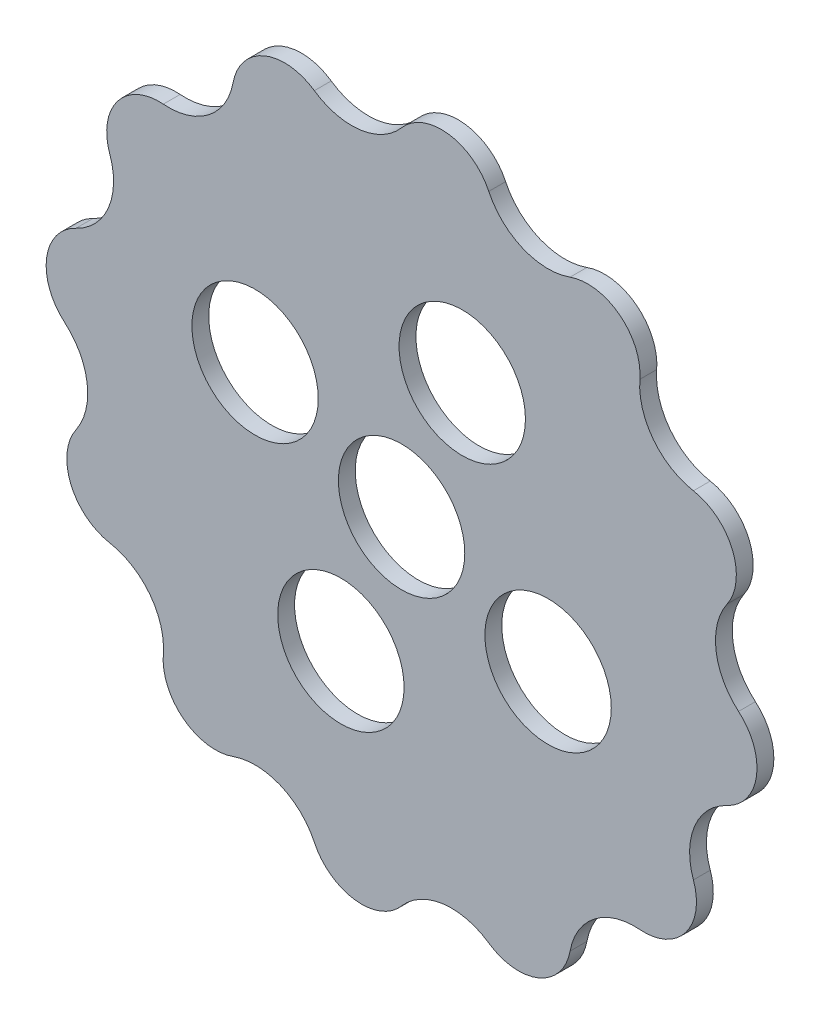
ISO-10303-21;
HEADER;
FILE_DESCRIPTION(('STEP AP214'),'2;1');
FILE_NAME('part.step','',(''),(''),'','','');
FILE_SCHEMA(('AUTOMOTIVE_DESIGN { 1 0 10303 214 1 1 1 1 }'));
ENDSEC;
DATA;
#1=APPLICATION_CONTEXT('core data for automotive mechanical design processes');
#2=APPLICATION_PROTOCOL_DEFINITION('international standard','automotive_design',2000,#1);
#3=PRODUCT_CONTEXT('',#1,'mechanical');
#4=PRODUCT('Part','Part','',(#3));
#5=PRODUCT_RELATED_PRODUCT_CATEGORY('part','',(#4));
#6=PRODUCT_DEFINITION_FORMATION('','',#4);
#7=PRODUCT_DEFINITION_CONTEXT('part definition',#1,'design');
#8=PRODUCT_DEFINITION('design','',#6,#7);
#9=PRODUCT_DEFINITION_SHAPE('','',#8);
#10=(LENGTH_UNIT() NAMED_UNIT(*) SI_UNIT(.MILLI.,.METRE.));
#11=(NAMED_UNIT(*) PLANE_ANGLE_UNIT() SI_UNIT($,.RADIAN.));
#12=(NAMED_UNIT(*) SI_UNIT($,.STERADIAN.) SOLID_ANGLE_UNIT());
#13=UNCERTAINTY_MEASURE_WITH_UNIT(LENGTH_MEASURE(1.E-05),#10,'distance_accuracy_value','');
#14=(GEOMETRIC_REPRESENTATION_CONTEXT(3) GLOBAL_UNCERTAINTY_ASSIGNED_CONTEXT((#13)) GLOBAL_UNIT_ASSIGNED_CONTEXT((#10,
#11,#12)) REPRESENTATION_CONTEXT('',''));
#15=CARTESIAN_POINT('',(0.,0.,0.));
#16=DIRECTION('',(0.,0.,1.));
#17=DIRECTION('',(1.,0.,0.));
#18=AXIS2_PLACEMENT_3D('',#15,#16,#17);
#19=CARTESIAN_POINT('',(0.,0.,4.));
#20=DIRECTION('',(0.,0.,1.));
#21=DIRECTION('',(1.,0.,0.));
#22=AXIS2_PLACEMENT_3D('',#19,#20,#21);
#23=PLANE('',#22);
#24=CARTESIAN_POINT('',(34.7813471063072,-14.4069056890388,4.));
#25=DIRECTION('',(0.,0.,1.));
#26=DIRECTION('',(1.,0.,0.));
#27=AXIS2_PLACEMENT_3D('',#24,#25,#26);
#28=CIRCLE('',#27,15.);
#29=CARTESIAN_POINT('',(49.7813471063072,-14.4069056890388,4.));
#30=VERTEX_POINT('',#29);
#31=EDGE_CURVE('E964',#30,#30,#28,.T.);
#32=ORIENTED_EDGE('',*,*,#31,.F.);
#33=EDGE_LOOP('',(#32));
#34=FACE_BOUND('',#33,.T.);
#35=CARTESIAN_POINT('',(-14.4069056890367,-34.7813471063081,4.));
#36=DIRECTION('',(0.,0.,1.));
#37=DIRECTION('',(1.,0.,0.));
#38=AXIS2_PLACEMENT_3D('',#35,#36,#37);
#39=CIRCLE('',#38,15.0000000000018);
#40=CARTESIAN_POINT('',(0.59309431096511,-34.7813471063081,4.));
#41=VERTEX_POINT('',#40);
#42=EDGE_CURVE('E970',#41,#41,#39,.T.);
#43=ORIENTED_EDGE('',*,*,#42,.F.);
#44=EDGE_LOOP('',(#43));
#45=FACE_BOUND('',#44,.T.);
#46=CARTESIAN_POINT('',(-34.7813471063067,14.4069056890373,4.));
#47=DIRECTION('',(0.,0.,1.));
#48=DIRECTION('',(1.,0.,0.));
#49=AXIS2_PLACEMENT_3D('',#46,#47,#48);
#50=CIRCLE('',#49,15.0000000000018);
#51=CARTESIAN_POINT('',(-19.7813471063049,14.4069056890373,4.));
#52=VERTEX_POINT('',#51);
#53=EDGE_CURVE('E981',#52,#52,#50,.T.);
#54=ORIENTED_EDGE('',*,*,#53,.F.);
#55=EDGE_LOOP('',(#54));
#56=FACE_BOUND('',#55,.T.);
#57=CARTESIAN_POINT('',(14.4069056890387,34.7813471063073,4.));
#58=DIRECTION('',(0.,0.,1.));
#59=DIRECTION('',(1.,0.,0.));
#60=AXIS2_PLACEMENT_3D('',#57,#58,#59);
#61=CIRCLE('',#60,15.);
#62=CARTESIAN_POINT('',(29.4069056890387,34.7813471063073,4.));
#63=VERTEX_POINT('',#62);
#64=EDGE_CURVE('E965',#63,#63,#61,.T.);
#65=ORIENTED_EDGE('',*,*,#64,.F.);
#66=EDGE_LOOP('',(#65));
#67=FACE_BOUND('',#66,.T.);
#68=CARTESIAN_POINT('',(0.,0.,4.));
#69=DIRECTION('',(0.,0.,1.));
#70=DIRECTION('',(1.,0.,0.));
#71=AXIS2_PLACEMENT_3D('',#68,#69,#70);
#72=CIRCLE('',#71,15.);
#73=CARTESIAN_POINT('',(15.,0.,4.));
#74=VERTEX_POINT('',#73);
#75=EDGE_CURVE('E354',#74,#74,#72,.T.);
#76=ORIENTED_EDGE('',*,*,#75,.F.);
#77=EDGE_LOOP('',(#76));
#78=FACE_BOUND('',#77,.T.);
#79=CARTESIAN_POINT('',(72.0854743188944,55.3131298861517,4.));
#80=DIRECTION('',(0.,0.,1.));
#81=DIRECTION('',(1.,0.,0.));
#82=AXIS2_PLACEMENT_3D('',#79,#80,#81);
#83=CIRCLE('',#82,15.5676341827527);
#84=CARTESIAN_POINT('',(56.5685424949239,56.5685424949237,4.));
#85=VERTEX_POINT('',#84);
#86=CARTESIAN_POINT('',(69.2820323027552,39.9999999999999,4.));
#87=VERTEX_POINT('',#86);
#88=EDGE_CURVE('E349',#85,#87,#83,.T.);
#89=ORIENTED_EDGE('',*,*,#88,.F.);
#90=CARTESIAN_POINT('',(44.1759199829254,57.5711797903511,4.));
#91=DIRECTION('',(0.,0.,1.));
#92=DIRECTION('',(1.,0.,0.));
#93=AXIS2_PLACEMENT_3D('',#90,#91,#92);
#94=CIRCLE('',#93,12.4331160322372);
#95=CARTESIAN_POINT('',(40.0000000000001,69.282032302755,4.));
#96=VERTEX_POINT('',#95);
#97=EDGE_CURVE('E340',#96,#85,#94,.F.);
#98=ORIENTED_EDGE('',*,*,#97,.F.);
#99=CARTESIAN_POINT('',(34.7712870609374,83.9453128036828,4.));
#100=DIRECTION('',(0.,0.,1.));
#101=DIRECTION('',(1.,0.,0.));
#102=AXIS2_PLACEMENT_3D('',#99,#100,#101);
#103=CIRCLE('',#102,15.5676341827527);
#104=CARTESIAN_POINT('',(20.7055236082017,77.2740661031254,4.));
#105=VERTEX_POINT('',#104);
#106=EDGE_CURVE('E444',#105,#96,#103,.T.);
#107=ORIENTED_EDGE('',*,*,#106,.F.);
#108=CARTESIAN_POINT('',(9.47187904558642,71.9460642157481,4.));
#109=DIRECTION('',(0.,0.,1.));
#110=DIRECTION('',(1.,0.,0.));
#111=AXIS2_PLACEMENT_3D('',#108,#109,#110);
#112=CIRCLE('',#111,12.4331160322372);
#113=CARTESIAN_POINT('',(0.,80.,4.));
#114=VERTEX_POINT('',#113);
#115=EDGE_CURVE('E441',#114,#105,#112,.F.);
#116=ORIENTED_EDGE('',*,*,#115,.F.);
#117=CARTESIAN_POINT('',(-11.8598384847883,90.084416947087,4.));
#118=DIRECTION('',(0.,0.,1.));
#119=DIRECTION('',(1.,0.,0.));
#120=AXIS2_PLACEMENT_3D('',#117,#118,#119);
#121=CIRCLE('',#120,15.5676341827524);
#122=CARTESIAN_POINT('',(-20.7055236082037,77.2740661031249,4.));
#123=VERTEX_POINT('',#122);
#124=EDGE_CURVE('E404',#123,#114,#121,.T.);
#125=ORIENTED_EDGE('',*,*,#124,.F.);
#126=CARTESIAN_POINT('',(-27.7701442328225,67.0430588359355,4.));
#127=DIRECTION('',(0.,0.,1.));
#128=DIRECTION('',(1.,0.,0.));
#129=AXIS2_PLACEMENT_3D('',#126,#127,#128);
#130=CIRCLE('',#129,12.4331160322372);
#131=CARTESIAN_POINT('',(-40.0000000000001,69.2820323027551,4.));
#132=VERTEX_POINT('',#131);
#133=EDGE_CURVE('E456',#132,#123,#130,.F.);
#134=ORIENTED_EDGE('',*,*,#133,.F.);
#135=CARTESIAN_POINT('',(-55.3131298861518,72.0854743188941,4.));
#136=DIRECTION('',(0.,0.,1.));
#137=DIRECTION('',(1.,0.,0.));
#138=AXIS2_PLACEMENT_3D('',#135,#136,#137);
#139=CIRCLE('',#138,15.5676341827526);
#140=CARTESIAN_POINT('',(-56.5685424949238,56.5685424949238,4.));
#141=VERTEX_POINT('',#140);
#142=EDGE_CURVE('E465',#141,#132,#139,.T.);
#143=ORIENTED_EDGE('',*,*,#142,.F.);
#144=CARTESIAN_POINT('',(-57.5711797903512,44.1759199829252,4.));
#145=DIRECTION('',(0.,0.,1.));
#146=DIRECTION('',(1.,0.,0.));
#147=AXIS2_PLACEMENT_3D('',#144,#145,#146);
#148=CIRCLE('',#147,12.4331160322372);
#149=CARTESIAN_POINT('',(-69.2820323027551,39.9999999999999,4.));
#150=VERTEX_POINT('',#149);
#151=EDGE_CURVE('E462',#150,#141,#148,.F.);
#152=ORIENTED_EDGE('',*,*,#151,.F.);
#153=CARTESIAN_POINT('',(-83.9453128036828,34.7712870609372,4.));
#154=DIRECTION('',(0.,0.,1.));
#155=DIRECTION('',(1.,0.,0.));
#156=AXIS2_PLACEMENT_3D('',#153,#154,#155);
#157=CIRCLE('',#156,15.5676341827526);
#158=CARTESIAN_POINT('',(-77.2740661031254,20.7055236082017,4.));
#159=VERTEX_POINT('',#158);
#160=EDGE_CURVE('E392',#159,#150,#157,.T.);
#161=ORIENTED_EDGE('',*,*,#160,.F.);
#162=CARTESIAN_POINT('',(-71.9460642157481,9.47187904558632,4.));
#163=DIRECTION('',(0.,0.,1.));
#164=DIRECTION('',(1.,0.,0.));
#165=AXIS2_PLACEMENT_3D('',#162,#163,#164);
#166=CIRCLE('',#165,12.4331160322372);
#167=CARTESIAN_POINT('',(-80.,0.,4.));
#168=VERTEX_POINT('',#167);
#169=EDGE_CURVE('E476',#168,#159,#166,.F.);
#170=ORIENTED_EDGE('',*,*,#169,.F.);
#171=CARTESIAN_POINT('',(-90.0844169470891,-11.8598384847887,4.));
#172=DIRECTION('',(0.,0.,1.));
#173=DIRECTION('',(1.,0.,0.));
#174=AXIS2_PLACEMENT_3D('',#171,#172,#173);
#175=CIRCLE('',#174,15.5676341827527);
#176=CARTESIAN_POINT('',(-77.2740661031254,-20.7055236082017,4.));
#177=VERTEX_POINT('',#176);
#178=EDGE_CURVE('E484',#177,#168,#175,.T.);
#179=ORIENTED_EDGE('',*,*,#178,.F.);
#180=CARTESIAN_POINT('',(-67.0430588359376,-27.7701442328228,4.));
#181=DIRECTION('',(0.,0.,1.));
#182=DIRECTION('',(1.,0.,0.));
#183=AXIS2_PLACEMENT_3D('',#180,#181,#182);
#184=CIRCLE('',#183,12.4331160322372);
#185=CARTESIAN_POINT('',(-69.282032302755,-40.0000000000001,4.));
#186=VERTEX_POINT('',#185);
#187=EDGE_CURVE('E481',#186,#177,#184,.F.);
#188=ORIENTED_EDGE('',*,*,#187,.F.);
#189=CARTESIAN_POINT('',(-72.0854743188943,-55.3131298861519,4.));
#190=DIRECTION('',(0.,0.,1.));
#191=DIRECTION('',(1.,0.,0.));
#192=AXIS2_PLACEMENT_3D('',#189,#190,#191);
#193=CIRCLE('',#192,15.5676341827526);
#194=CARTESIAN_POINT('',(-56.5685424949239,-56.5685424949237,4.));
#195=VERTEX_POINT('',#194);
#196=EDGE_CURVE('E380',#195,#186,#193,.T.);
#197=ORIENTED_EDGE('',*,*,#196,.F.);
#198=CARTESIAN_POINT('',(-44.1759199829254,-57.5711797903513,4.));
#199=DIRECTION('',(0.,0.,1.));
#200=DIRECTION('',(1.,0.,0.));
#201=AXIS2_PLACEMENT_3D('',#198,#199,#200);
#202=CIRCLE('',#201,12.4331160322372);
#203=CARTESIAN_POINT('',(-40.,-69.2820323027551,4.));
#204=VERTEX_POINT('',#203);
#205=EDGE_CURVE('E495',#204,#195,#202,.F.);
#206=ORIENTED_EDGE('',*,*,#205,.F.);
#207=CARTESIAN_POINT('',(-34.7712870609373,-83.9453128036829,4.));
#208=DIRECTION('',(0.,0.,1.));
#209=DIRECTION('',(1.,0.,0.));
#210=AXIS2_PLACEMENT_3D('',#207,#208,#209);
#211=CIRCLE('',#210,15.5676341827527);
#212=CARTESIAN_POINT('',(-20.7055236082018,-77.2740661031254,4.));
#213=VERTEX_POINT('',#212);
#214=EDGE_CURVE('E502',#213,#204,#211,.T.);
#215=ORIENTED_EDGE('',*,*,#214,.F.);
#216=CARTESIAN_POINT('',(-9.47187904558641,-71.9460642157482,4.));
#217=DIRECTION('',(0.,0.,1.));
#218=DIRECTION('',(1.,0.,0.));
#219=AXIS2_PLACEMENT_3D('',#216,#217,#218);
#220=CIRCLE('',#219,12.4331160322372);
#221=CARTESIAN_POINT('',(0.,-80.,4.));
#222=VERTEX_POINT('',#221);
#223=EDGE_CURVE('E439',#222,#213,#220,.F.);
#224=ORIENTED_EDGE('',*,*,#223,.F.);
#225=CARTESIAN_POINT('',(11.8598384847886,-90.0844169470892,4.));
#226=DIRECTION('',(0.,0.,1.));
#227=DIRECTION('',(1.,0.,0.));
#228=AXIS2_PLACEMENT_3D('',#225,#226,#227);
#229=CIRCLE('',#228,15.5676341827527);
#230=CARTESIAN_POINT('',(20.7055236082015,-77.2740661031255,4.));
#231=VERTEX_POINT('',#230);
#232=EDGE_CURVE('E368',#231,#222,#229,.T.);
#233=ORIENTED_EDGE('',*,*,#232,.F.);
#234=CARTESIAN_POINT('',(27.7701442328227,-67.0430588359377,4.));
#235=DIRECTION('',(0.,0.,1.));
#236=DIRECTION('',(1.,0.,0.));
#237=AXIS2_PLACEMENT_3D('',#234,#235,#236);
#238=CIRCLE('',#237,12.4331160322372);
#239=CARTESIAN_POINT('',(40.,-69.2820323027551,4.));
#240=VERTEX_POINT('',#239);
#241=EDGE_CURVE('E432',#240,#231,#238,.F.);
#242=ORIENTED_EDGE('',*,*,#241,.F.);
#243=CARTESIAN_POINT('',(55.3131298861518,-72.0854743188943,4.));
#244=DIRECTION('',(0.,0.,1.));
#245=DIRECTION('',(1.,0.,0.));
#246=AXIS2_PLACEMENT_3D('',#243,#244,#245);
#247=CIRCLE('',#246,15.5676341827526);
#248=CARTESIAN_POINT('',(56.5685424949236,-56.568542494924,4.));
#249=VERTEX_POINT('',#248);
#250=EDGE_CURVE('E429',#249,#240,#247,.T.);
#251=ORIENTED_EDGE('',*,*,#250,.F.);
#252=CARTESIAN_POINT('',(57.5711797903512,-44.1759199829254,4.));
#253=DIRECTION('',(0.,0.,1.));
#254=DIRECTION('',(1.,0.,0.));
#255=AXIS2_PLACEMENT_3D('',#252,#253,#254);
#256=CIRCLE('',#255,12.4331160322372);
#257=CARTESIAN_POINT('',(69.2820323027551,-40.0000000000001,4.));
#258=VERTEX_POINT('',#257);
#259=EDGE_CURVE('E423',#258,#249,#256,.F.);
#260=ORIENTED_EDGE('',*,*,#259,.F.);
#261=CARTESIAN_POINT('',(83.9453128036828,-34.7712870609374,4.));
#262=DIRECTION('',(0.,0.,1.));
#263=DIRECTION('',(1.,0.,0.));
#264=AXIS2_PLACEMENT_3D('',#261,#262,#263);
#265=CIRCLE('',#264,15.5676341827526);
#266=CARTESIAN_POINT('',(77.2740661031254,-20.7055236082019,4.));
#267=VERTEX_POINT('',#266);
#268=EDGE_CURVE('E357',#267,#258,#265,.T.);
#269=ORIENTED_EDGE('',*,*,#268,.F.);
#270=CARTESIAN_POINT('',(71.9460642157481,-9.4718790455865,4.));
#271=DIRECTION('',(0.,0.,1.));
#272=DIRECTION('',(1.,0.,0.));
#273=AXIS2_PLACEMENT_3D('',#270,#271,#272);
#274=CIRCLE('',#273,12.4331160322372);
#275=CARTESIAN_POINT('',(80.,0.,4.));
#276=VERTEX_POINT('',#275);
#277=EDGE_CURVE('E511',#276,#267,#274,.F.);
#278=ORIENTED_EDGE('',*,*,#277,.F.);
#279=CARTESIAN_POINT('',(90.0844169470891,11.8598384847885,4.));
#280=DIRECTION('',(0.,0.,1.));
#281=DIRECTION('',(1.,0.,0.));
#282=AXIS2_PLACEMENT_3D('',#279,#280,#281);
#283=CIRCLE('',#282,15.5676341827526);
#284=CARTESIAN_POINT('',(77.2740661031255,20.7055236082015,4.));
#285=VERTEX_POINT('',#284);
#286=EDGE_CURVE('E518',#285,#276,#283,.T.);
#287=ORIENTED_EDGE('',*,*,#286,.F.);
#288=CARTESIAN_POINT('',(67.0430588359376,27.7701442328226,4.));
#289=DIRECTION('',(0.,0.,1.));
#290=DIRECTION('',(1.,0.,0.));
#291=AXIS2_PLACEMENT_3D('',#288,#289,#290);
#292=CIRCLE('',#291,12.4331160322372);
#293=EDGE_CURVE('E416',#87,#285,#292,.F.);
#294=ORIENTED_EDGE('',*,*,#293,.F.);
#295=EDGE_LOOP('',(#89,#98,#107,#116,#125,#134,#143,#152,#161,#170,#179,#188,#197,#206,#215,
#224,#233,#242,#251,#260,#269,#278,#287,#294));
#296=FACE_BOUND('',#295,.T.);
#297=ADVANCED_FACE('F162',(#34,#45,#56,#67,#78,#296),#23,.T.);
#298=CARTESIAN_POINT('',(0.,0.,0.));
#299=DIRECTION('',(0.,0.,1.));
#300=DIRECTION('',(1.,0.,0.));
#301=AXIS2_PLACEMENT_3D('',#298,#299,#300);
#302=PLANE('',#301);
#303=CARTESIAN_POINT('',(34.7813471063072,-14.4069056890388,0.));
#304=DIRECTION('',(0.,0.,1.));
#305=DIRECTION('',(1.,0.,0.));
#306=AXIS2_PLACEMENT_3D('',#303,#304,#305);
#307=CIRCLE('',#306,15.);
#308=CARTESIAN_POINT('',(49.7813471063072,-14.4069056890388,0.));
#309=VERTEX_POINT('',#308);
#310=EDGE_CURVE('E962',#309,#309,#307,.T.);
#311=ORIENTED_EDGE('',*,*,#310,.T.);
#312=EDGE_LOOP('',(#311));
#313=FACE_BOUND('',#312,.T.);
#314=CARTESIAN_POINT('',(-14.4069056890367,-34.7813471063081,0.));
#315=DIRECTION('',(0.,0.,1.));
#316=DIRECTION('',(1.,0.,0.));
#317=AXIS2_PLACEMENT_3D('',#314,#315,#316);
#318=CIRCLE('',#317,15.0000000000018);
#319=CARTESIAN_POINT('',(0.59309431096511,-34.7813471063081,0.));
#320=VERTEX_POINT('',#319);
#321=EDGE_CURVE('E978',#320,#320,#318,.T.);
#322=ORIENTED_EDGE('',*,*,#321,.T.);
#323=EDGE_LOOP('',(#322));
#324=FACE_BOUND('',#323,.T.);
#325=CARTESIAN_POINT('',(-34.7813471063067,14.4069056890373,0.));
#326=DIRECTION('',(0.,0.,1.));
#327=DIRECTION('',(1.,0.,0.));
#328=AXIS2_PLACEMENT_3D('',#325,#326,#327);
#329=CIRCLE('',#328,15.0000000000018);
#330=CARTESIAN_POINT('',(-19.7813471063049,14.4069056890373,0.));
#331=VERTEX_POINT('',#330);
#332=EDGE_CURVE('E973',#331,#331,#329,.T.);
#333=ORIENTED_EDGE('',*,*,#332,.T.);
#334=EDGE_LOOP('',(#333));
#335=FACE_BOUND('',#334,.T.);
#336=CARTESIAN_POINT('',(14.4069056890387,34.7813471063073,0.));
#337=DIRECTION('',(0.,0.,1.));
#338=DIRECTION('',(1.,0.,0.));
#339=AXIS2_PLACEMENT_3D('',#336,#337,#338);
#340=CIRCLE('',#339,15.);
#341=CARTESIAN_POINT('',(29.4069056890387,34.7813471063073,0.));
#342=VERTEX_POINT('',#341);
#343=EDGE_CURVE('E968',#342,#342,#340,.T.);
#344=ORIENTED_EDGE('',*,*,#343,.T.);
#345=EDGE_LOOP('',(#344));
#346=FACE_BOUND('',#345,.T.);
#347=CARTESIAN_POINT('',(0.,0.,0.));
#348=DIRECTION('',(0.,0.,1.));
#349=DIRECTION('',(1.,0.,0.));
#350=AXIS2_PLACEMENT_3D('',#347,#348,#349);
#351=CIRCLE('',#350,15.);
#352=CARTESIAN_POINT('',(15.,0.,0.));
#353=VERTEX_POINT('',#352);
#354=EDGE_CURVE('E351',#353,#353,#351,.T.);
#355=ORIENTED_EDGE('',*,*,#354,.T.);
#356=EDGE_LOOP('',(#355));
#357=FACE_BOUND('',#356,.T.);
#358=CARTESIAN_POINT('',(44.1759199829254,57.5711797903511,0.));
#359=DIRECTION('',(0.,0.,1.));
#360=DIRECTION('',(1.,0.,0.));
#361=AXIS2_PLACEMENT_3D('',#358,#359,#360);
#362=CIRCLE('',#361,12.4331160322372);
#363=CARTESIAN_POINT('',(40.0000000000001,69.282032302755,0.));
#364=VERTEX_POINT('',#363);
#365=CARTESIAN_POINT('',(56.5685424949239,56.5685424949237,0.));
#366=VERTEX_POINT('',#365);
#367=EDGE_CURVE('E325',#364,#366,#362,.F.);
#368=ORIENTED_EDGE('',*,*,#367,.T.);
#369=CARTESIAN_POINT('',(72.0854743188944,55.3131298861517,0.));
#370=DIRECTION('',(0.,0.,1.));
#371=DIRECTION('',(1.,0.,0.));
#372=AXIS2_PLACEMENT_3D('',#369,#370,#371);
#373=CIRCLE('',#372,15.5676341827527);
#374=CARTESIAN_POINT('',(69.2820323027552,39.9999999999999,0.));
#375=VERTEX_POINT('',#374);
#376=EDGE_CURVE('E329',#366,#375,#373,.T.);
#377=ORIENTED_EDGE('',*,*,#376,.T.);
#378=CARTESIAN_POINT('',(67.0430588359376,27.7701442328226,0.));
#379=DIRECTION('',(0.,0.,1.));
#380=DIRECTION('',(1.,0.,0.));
#381=AXIS2_PLACEMENT_3D('',#378,#379,#380);
#382=CIRCLE('',#381,12.4331160322372);
#383=CARTESIAN_POINT('',(77.2740661031255,20.7055236082015,0.));
#384=VERTEX_POINT('',#383);
#385=EDGE_CURVE('E508',#375,#384,#382,.F.);
#386=ORIENTED_EDGE('',*,*,#385,.T.);
#387=CARTESIAN_POINT('',(90.0844169470891,11.8598384847885,0.));
#388=DIRECTION('',(0.,0.,1.));
#389=DIRECTION('',(1.,0.,0.));
#390=AXIS2_PLACEMENT_3D('',#387,#388,#389);
#391=CIRCLE('',#390,15.5676341827526);
#392=CARTESIAN_POINT('',(80.,0.,0.));
#393=VERTEX_POINT('',#392);
#394=EDGE_CURVE('E510',#384,#393,#391,.T.);
#395=ORIENTED_EDGE('',*,*,#394,.T.);
#396=CARTESIAN_POINT('',(71.9460642157481,-9.4718790455865,0.));
#397=DIRECTION('',(0.,0.,1.));
#398=DIRECTION('',(1.,0.,0.));
#399=AXIS2_PLACEMENT_3D('',#396,#397,#398);
#400=CIRCLE('',#399,12.4331160322372);
#401=CARTESIAN_POINT('',(77.2740661031254,-20.7055236082019,0.));
#402=VERTEX_POINT('',#401);
#403=EDGE_CURVE('E514',#393,#402,#400,.F.);
#404=ORIENTED_EDGE('',*,*,#403,.T.);
#405=CARTESIAN_POINT('',(83.9453128036828,-34.7712870609374,0.));
#406=DIRECTION('',(0.,0.,1.));
#407=DIRECTION('',(1.,0.,0.));
#408=AXIS2_PLACEMENT_3D('',#405,#406,#407);
#409=CIRCLE('',#408,15.5676341827526);
#410=CARTESIAN_POINT('',(69.2820323027551,-40.0000000000001,0.));
#411=VERTEX_POINT('',#410);
#412=EDGE_CURVE('E359',#402,#411,#409,.T.);
#413=ORIENTED_EDGE('',*,*,#412,.T.);
#414=CARTESIAN_POINT('',(57.5711797903512,-44.1759199829254,0.));
#415=DIRECTION('',(0.,0.,1.));
#416=DIRECTION('',(1.,0.,0.));
#417=AXIS2_PLACEMENT_3D('',#414,#415,#416);
#418=CIRCLE('',#417,12.4331160322372);
#419=CARTESIAN_POINT('',(56.5685424949236,-56.568542494924,0.));
#420=VERTEX_POINT('',#419);
#421=EDGE_CURVE('E425',#411,#420,#418,.F.);
#422=ORIENTED_EDGE('',*,*,#421,.T.);
#423=CARTESIAN_POINT('',(55.3131298861518,-72.0854743188943,0.));
#424=DIRECTION('',(0.,0.,1.));
#425=DIRECTION('',(1.,0.,0.));
#426=AXIS2_PLACEMENT_3D('',#423,#424,#425);
#427=CIRCLE('',#426,15.5676341827526);
#428=CARTESIAN_POINT('',(40.,-69.2820323027551,0.));
#429=VERTEX_POINT('',#428);
#430=EDGE_CURVE('E419',#420,#429,#427,.T.);
#431=ORIENTED_EDGE('',*,*,#430,.T.);
#432=CARTESIAN_POINT('',(27.7701442328227,-67.0430588359377,0.));
#433=DIRECTION('',(0.,0.,1.));
#434=DIRECTION('',(1.,0.,0.));
#435=AXIS2_PLACEMENT_3D('',#432,#433,#434);
#436=CIRCLE('',#435,12.4331160322372);
#437=CARTESIAN_POINT('',(20.7055236082015,-77.2740661031255,0.));
#438=VERTEX_POINT('',#437);
#439=EDGE_CURVE('E422',#429,#438,#436,.F.);
#440=ORIENTED_EDGE('',*,*,#439,.T.);
#441=CARTESIAN_POINT('',(11.8598384847886,-90.0844169470892,0.));
#442=DIRECTION('',(0.,0.,1.));
#443=DIRECTION('',(1.,0.,0.));
#444=AXIS2_PLACEMENT_3D('',#441,#442,#443);
#445=CIRCLE('',#444,15.5676341827527);
#446=CARTESIAN_POINT('',(0.,-80.,0.));
#447=VERTEX_POINT('',#446);
#448=EDGE_CURVE('E371',#438,#447,#445,.T.);
#449=ORIENTED_EDGE('',*,*,#448,.T.);
#450=CARTESIAN_POINT('',(-9.47187904558641,-71.9460642157482,0.));
#451=DIRECTION('',(0.,0.,1.));
#452=DIRECTION('',(1.,0.,0.));
#453=AXIS2_PLACEMENT_3D('',#450,#451,#452);
#454=CIRCLE('',#453,12.4331160322372);
#455=CARTESIAN_POINT('',(-20.7055236082018,-77.2740661031254,0.));
#456=VERTEX_POINT('',#455);
#457=EDGE_CURVE('E491',#447,#456,#454,.F.);
#458=ORIENTED_EDGE('',*,*,#457,.T.);
#459=CARTESIAN_POINT('',(-34.7712870609373,-83.9453128036829,0.));
#460=DIRECTION('',(0.,0.,1.));
#461=DIRECTION('',(1.,0.,0.));
#462=AXIS2_PLACEMENT_3D('',#459,#460,#461);
#463=CIRCLE('',#462,15.5676341827527);
#464=CARTESIAN_POINT('',(-40.,-69.2820323027552,0.));
#465=VERTEX_POINT('',#464);
#466=EDGE_CURVE('E494',#456,#465,#463,.T.);
#467=ORIENTED_EDGE('',*,*,#466,.T.);
#468=CARTESIAN_POINT('',(-44.1759199829254,-57.5711797903513,0.));
#469=DIRECTION('',(0.,0.,1.));
#470=DIRECTION('',(1.,0.,0.));
#471=AXIS2_PLACEMENT_3D('',#468,#469,#470);
#472=CIRCLE('',#471,12.4331160322372);
#473=CARTESIAN_POINT('',(-56.5685424949239,-56.5685424949237,0.));
#474=VERTEX_POINT('',#473);
#475=EDGE_CURVE('E179',#465,#474,#472,.F.);
#476=ORIENTED_EDGE('',*,*,#475,.T.);
#477=CARTESIAN_POINT('',(-72.0854743188943,-55.3131298861519,0.));
#478=DIRECTION('',(0.,0.,1.));
#479=DIRECTION('',(1.,0.,0.));
#480=AXIS2_PLACEMENT_3D('',#477,#478,#479);
#481=CIRCLE('',#480,15.5676341827526);
#482=CARTESIAN_POINT('',(-69.282032302755,-40.0000000000001,0.));
#483=VERTEX_POINT('',#482);
#484=EDGE_CURVE('E383',#474,#483,#481,.T.);
#485=ORIENTED_EDGE('',*,*,#484,.T.);
#486=CARTESIAN_POINT('',(-67.0430588359376,-27.7701442328228,0.));
#487=DIRECTION('',(0.,0.,1.));
#488=DIRECTION('',(1.,0.,0.));
#489=AXIS2_PLACEMENT_3D('',#486,#487,#488);
#490=CIRCLE('',#489,12.4331160322372);
#491=CARTESIAN_POINT('',(-77.2740661031254,-20.7055236082017,0.));
#492=VERTEX_POINT('',#491);
#493=EDGE_CURVE('E472',#483,#492,#490,.F.);
#494=ORIENTED_EDGE('',*,*,#493,.T.);
#495=CARTESIAN_POINT('',(-90.0844169470891,-11.8598384847887,0.));
#496=DIRECTION('',(0.,0.,1.));
#497=DIRECTION('',(1.,0.,0.));
#498=AXIS2_PLACEMENT_3D('',#495,#496,#497);
#499=CIRCLE('',#498,15.5676341827527);
#500=CARTESIAN_POINT('',(-80.,-1.16226472890446E-13,0.));
#501=VERTEX_POINT('',#500);
#502=EDGE_CURVE('E475',#492,#501,#499,.T.);
#503=ORIENTED_EDGE('',*,*,#502,.T.);
#504=CARTESIAN_POINT('',(-71.9460642157481,9.47187904558632,0.));
#505=DIRECTION('',(0.,0.,1.));
#506=DIRECTION('',(1.,0.,0.));
#507=AXIS2_PLACEMENT_3D('',#504,#505,#506);
#508=CIRCLE('',#507,12.4331160322372);
#509=CARTESIAN_POINT('',(-77.2740661031254,20.7055236082017,0.));
#510=VERTEX_POINT('',#509);
#511=EDGE_CURVE('E187',#501,#510,#508,.F.);
#512=ORIENTED_EDGE('',*,*,#511,.T.);
#513=CARTESIAN_POINT('',(-83.9453128036828,34.7712870609372,0.));
#514=DIRECTION('',(0.,0.,1.));
#515=DIRECTION('',(1.,0.,0.));
#516=AXIS2_PLACEMENT_3D('',#513,#514,#515);
#517=CIRCLE('',#516,15.5676341827526);
#518=CARTESIAN_POINT('',(-69.2820323027551,39.9999999999999,0.));
#519=VERTEX_POINT('',#518);
#520=EDGE_CURVE('E395',#510,#519,#517,.T.);
#521=ORIENTED_EDGE('',*,*,#520,.T.);
#522=CARTESIAN_POINT('',(-57.5711797903512,44.1759199829252,0.));
#523=DIRECTION('',(0.,0.,1.));
#524=DIRECTION('',(1.,0.,0.));
#525=AXIS2_PLACEMENT_3D('',#522,#523,#524);
#526=CIRCLE('',#525,12.4331160322372);
#527=CARTESIAN_POINT('',(-56.5685424949238,56.5685424949238,0.));
#528=VERTEX_POINT('',#527);
#529=EDGE_CURVE('E452',#519,#528,#526,.F.);
#530=ORIENTED_EDGE('',*,*,#529,.T.);
#531=CARTESIAN_POINT('',(-55.3131298861518,72.0854743188941,0.));
#532=DIRECTION('',(0.,0.,1.));
#533=DIRECTION('',(1.,0.,0.));
#534=AXIS2_PLACEMENT_3D('',#531,#532,#533);
#535=CIRCLE('',#534,15.5676341827526);
#536=CARTESIAN_POINT('',(-40.,69.282032302755,0.));
#537=VERTEX_POINT('',#536);
#538=EDGE_CURVE('E455',#528,#537,#535,.T.);
#539=ORIENTED_EDGE('',*,*,#538,.T.);
#540=CARTESIAN_POINT('',(-27.7701442328225,67.0430588359355,0.));
#541=DIRECTION('',(0.,0.,1.));
#542=DIRECTION('',(1.,0.,0.));
#543=AXIS2_PLACEMENT_3D('',#540,#541,#542);
#544=CIRCLE('',#543,12.4331160322372);
#545=CARTESIAN_POINT('',(-20.7055236082037,77.2740661031249,0.));
#546=VERTEX_POINT('',#545);
#547=EDGE_CURVE('E459',#537,#546,#544,.F.);
#548=ORIENTED_EDGE('',*,*,#547,.T.);
#549=CARTESIAN_POINT('',(-11.8598384847883,90.084416947087,0.));
#550=DIRECTION('',(0.,0.,1.));
#551=DIRECTION('',(1.,0.,0.));
#552=AXIS2_PLACEMENT_3D('',#549,#550,#551);
#553=CIRCLE('',#552,15.5676341827524);
#554=CARTESIAN_POINT('',(0.,80.,0.));
#555=VERTEX_POINT('',#554);
#556=EDGE_CURVE('E407',#546,#555,#553,.T.);
#557=ORIENTED_EDGE('',*,*,#556,.T.);
#558=CARTESIAN_POINT('',(9.47187904558642,71.9460642157481,0.));
#559=DIRECTION('',(0.,0.,1.));
#560=DIRECTION('',(1.,0.,0.));
#561=AXIS2_PLACEMENT_3D('',#558,#559,#560);
#562=CIRCLE('',#561,12.4331160322372);
#563=CARTESIAN_POINT('',(20.7055236082017,77.2740661031254,0.));
#564=VERTEX_POINT('',#563);
#565=EDGE_CURVE('E334',#555,#564,#562,.F.);
#566=ORIENTED_EDGE('',*,*,#565,.T.);
#567=CARTESIAN_POINT('',(34.7712870609374,83.9453128036828,0.));
#568=DIRECTION('',(0.,0.,1.));
#569=DIRECTION('',(1.,0.,0.));
#570=AXIS2_PLACEMENT_3D('',#567,#568,#569);
#571=CIRCLE('',#570,15.5676341827527);
#572=EDGE_CURVE('E332',#564,#364,#571,.T.);
#573=ORIENTED_EDGE('',*,*,#572,.T.);
#574=EDGE_LOOP('',(#368,#377,#386,#395,#404,#413,#422,#431,#440,#449,#458,#467,#476,#485,#494,
#503,#512,#521,#530,#539,#548,#557,#566,#573));
#575=FACE_BOUND('',#574,.T.);
#576=ADVANCED_FACE('F164',(#313,#324,#335,#346,#357,#575),#302,.F.);
#577=CARTESIAN_POINT('',(67.0430588359376,27.7701442328226,0.));
#578=DIRECTION('',(0.,0.,1.));
#579=DIRECTION('',(1.,0.,0.));
#580=AXIS2_PLACEMENT_3D('',#577,#578,#579);
#581=CYLINDRICAL_SURFACE('',#580,12.4331160322372);
#582=ORIENTED_EDGE('',*,*,#293,.T.);
#583=DIRECTION('',(0.,0.,1.));
#584=VECTOR('',#583,1.);
#585=CARTESIAN_POINT('',(77.2740661031255,20.7055236082015,0.));
#586=LINE('',#585,#584);
#587=EDGE_CURVE('E166',#384,#285,#586,.T.);
#588=ORIENTED_EDGE('',*,*,#587,.F.);
#589=ORIENTED_EDGE('',*,*,#385,.F.);
#590=DIRECTION('',(0.,0.,1.));
#591=VECTOR('',#590,1.);
#592=CARTESIAN_POINT('',(69.2820323027552,39.9999999999999,0.));
#593=LINE('',#592,#591);
#594=EDGE_CURVE('E344',#375,#87,#593,.T.);
#595=ORIENTED_EDGE('',*,*,#594,.T.);
#596=EDGE_LOOP('',(#582,#588,#589,#595));
#597=FACE_BOUND('',#596,.T.);
#598=ADVANCED_FACE('F529',(#597),#581,.T.);
#599=CARTESIAN_POINT('',(71.9460642157481,-9.4718790455865,0.));
#600=DIRECTION('',(0.,0.,1.));
#601=DIRECTION('',(1.,0.,0.));
#602=AXIS2_PLACEMENT_3D('',#599,#600,#601);
#603=CYLINDRICAL_SURFACE('',#602,12.4331160322372);
#604=ORIENTED_EDGE('',*,*,#277,.T.);
#605=DIRECTION('',(0.,0.,1.));
#606=VECTOR('',#605,1.);
#607=CARTESIAN_POINT('',(77.2740661031254,-20.7055236082019,0.));
#608=LINE('',#607,#606);
#609=EDGE_CURVE('E362',#402,#267,#608,.T.);
#610=ORIENTED_EDGE('',*,*,#609,.F.);
#611=ORIENTED_EDGE('',*,*,#403,.F.);
#612=DIRECTION('',(0.,0.,1.));
#613=VECTOR('',#612,1.);
#614=CARTESIAN_POINT('',(80.,0.,0.));
#615=LINE('',#614,#613);
#616=EDGE_CURVE('E433',#393,#276,#615,.T.);
#617=ORIENTED_EDGE('',*,*,#616,.T.);
#618=EDGE_LOOP('',(#604,#610,#611,#617));
#619=FACE_BOUND('',#618,.T.);
#620=ADVANCED_FACE('F533',(#619),#603,.T.);
#621=CARTESIAN_POINT('',(90.0844169470891,11.8598384847885,0.));
#622=DIRECTION('',(0.,0.,1.));
#623=DIRECTION('',(1.,0.,0.));
#624=AXIS2_PLACEMENT_3D('',#621,#622,#623);
#625=CYLINDRICAL_SURFACE('',#624,15.5676341827526);
#626=ORIENTED_EDGE('',*,*,#286,.T.);
#627=ORIENTED_EDGE('',*,*,#616,.F.);
#628=ORIENTED_EDGE('',*,*,#394,.F.);
#629=ORIENTED_EDGE('',*,*,#587,.T.);
#630=EDGE_LOOP('',(#626,#627,#628,#629));
#631=FACE_BOUND('',#630,.T.);
#632=ADVANCED_FACE('F525',(#631),#625,.F.);
#633=CARTESIAN_POINT('',(34.7712870609374,83.9453128036828,0.));
#634=DIRECTION('',(0.,0.,1.));
#635=DIRECTION('',(1.,0.,0.));
#636=AXIS2_PLACEMENT_3D('',#633,#634,#635);
#637=CYLINDRICAL_SURFACE('',#636,15.5676341827527);
#638=ORIENTED_EDGE('',*,*,#106,.T.);
#639=DIRECTION('',(0.,0.,1.));
#640=VECTOR('',#639,1.);
#641=CARTESIAN_POINT('',(40.0000000000001,69.282032302755,0.));
#642=LINE('',#641,#640);
#643=EDGE_CURVE('E171',#364,#96,#642,.T.);
#644=ORIENTED_EDGE('',*,*,#643,.F.);
#645=ORIENTED_EDGE('',*,*,#572,.F.);
#646=DIRECTION('',(0.,0.,1.));
#647=VECTOR('',#646,1.);
#648=CARTESIAN_POINT('',(20.7055236082017,77.2740661031254,0.));
#649=LINE('',#648,#647);
#650=EDGE_CURVE('E12',#564,#105,#649,.T.);
#651=ORIENTED_EDGE('',*,*,#650,.T.);
#652=EDGE_LOOP('',(#638,#644,#645,#651));
#653=FACE_BOUND('',#652,.T.);
#654=ADVANCED_FACE('F600',(#653),#637,.F.);
#655=CARTESIAN_POINT('',(9.47187904558642,71.9460642157481,0.));
#656=DIRECTION('',(0.,0.,1.));
#657=DIRECTION('',(1.,0.,0.));
#658=AXIS2_PLACEMENT_3D('',#655,#656,#657);
#659=CYLINDRICAL_SURFACE('',#658,12.4331160322372);
#660=ORIENTED_EDGE('',*,*,#115,.T.);
#661=ORIENTED_EDGE('',*,*,#650,.F.);
#662=ORIENTED_EDGE('',*,*,#565,.F.);
#663=DIRECTION('',(0.,0.,1.));
#664=VECTOR('',#663,1.);
#665=CARTESIAN_POINT('',(0.,80.,0.));
#666=LINE('',#665,#664);
#667=EDGE_CURVE('E413',#555,#114,#666,.T.);
#668=ORIENTED_EDGE('',*,*,#667,.T.);
#669=EDGE_LOOP('',(#660,#661,#662,#668));
#670=FACE_BOUND('',#669,.T.);
#671=ADVANCED_FACE('F597',(#670),#659,.T.);
#672=CARTESIAN_POINT('',(44.1759199829254,57.5711797903511,0.));
#673=DIRECTION('',(0.,0.,1.));
#674=DIRECTION('',(1.,0.,0.));
#675=AXIS2_PLACEMENT_3D('',#672,#673,#674);
#676=CYLINDRICAL_SURFACE('',#675,12.4331160322372);
#677=ORIENTED_EDGE('',*,*,#97,.T.);
#678=DIRECTION('',(0.,0.,1.));
#679=VECTOR('',#678,1.);
#680=CARTESIAN_POINT('',(56.5685424949239,56.5685424949237,0.));
#681=LINE('',#680,#679);
#682=EDGE_CURVE('E337',#366,#85,#681,.T.);
#683=ORIENTED_EDGE('',*,*,#682,.F.);
#684=ORIENTED_EDGE('',*,*,#367,.F.);
#685=ORIENTED_EDGE('',*,*,#643,.T.);
#686=EDGE_LOOP('',(#677,#683,#684,#685));
#687=FACE_BOUND('',#686,.T.);
#688=ADVANCED_FACE('F338',(#687),#676,.T.);
#689=CARTESIAN_POINT('',(-57.5711797903512,44.1759199829252,0.));
#690=DIRECTION('',(0.,0.,1.));
#691=DIRECTION('',(1.,0.,0.));
#692=AXIS2_PLACEMENT_3D('',#689,#690,#691);
#693=CYLINDRICAL_SURFACE('',#692,12.4331160322372);
#694=ORIENTED_EDGE('',*,*,#151,.T.);
#695=DIRECTION('',(0.,0.,1.));
#696=VECTOR('',#695,1.);
#697=CARTESIAN_POINT('',(-56.5685424949238,56.5685424949238,0.));
#698=LINE('',#697,#696);
#699=EDGE_CURVE('E461',#528,#141,#698,.T.);
#700=ORIENTED_EDGE('',*,*,#699,.F.);
#701=ORIENTED_EDGE('',*,*,#529,.F.);
#702=DIRECTION('',(0.,0.,1.));
#703=VECTOR('',#702,1.);
#704=CARTESIAN_POINT('',(-69.2820323027551,39.9999999999999,0.));
#705=LINE('',#704,#703);
#706=EDGE_CURVE('E401',#519,#150,#705,.T.);
#707=ORIENTED_EDGE('',*,*,#706,.T.);
#708=EDGE_LOOP('',(#694,#700,#701,#707));
#709=FACE_BOUND('',#708,.T.);
#710=ADVANCED_FACE('F583',(#709),#693,.T.);
#711=CARTESIAN_POINT('',(-27.7701442328225,67.0430588359355,0.));
#712=DIRECTION('',(0.,0.,1.));
#713=DIRECTION('',(1.,0.,0.));
#714=AXIS2_PLACEMENT_3D('',#711,#712,#713);
#715=CYLINDRICAL_SURFACE('',#714,12.4331160322372);
#716=ORIENTED_EDGE('',*,*,#133,.T.);
#717=DIRECTION('',(0.,0.,1.));
#718=VECTOR('',#717,1.);
#719=CARTESIAN_POINT('',(-20.7055236082037,77.2740661031249,0.));
#720=LINE('',#719,#718);
#721=EDGE_CURVE('E410',#546,#123,#720,.T.);
#722=ORIENTED_EDGE('',*,*,#721,.F.);
#723=ORIENTED_EDGE('',*,*,#547,.F.);
#724=DIRECTION('',(0.,0.,1.));
#725=VECTOR('',#724,1.);
#726=CARTESIAN_POINT('',(-40.0000000000001,69.2820323027551,0.));
#727=LINE('',#726,#725);
#728=EDGE_CURVE('E447',#537,#132,#727,.T.);
#729=ORIENTED_EDGE('',*,*,#728,.T.);
#730=EDGE_LOOP('',(#716,#722,#723,#729));
#731=FACE_BOUND('',#730,.T.);
#732=ADVANCED_FACE('F590',(#731),#715,.T.);
#733=CARTESIAN_POINT('',(-55.3131298861518,72.0854743188941,0.));
#734=DIRECTION('',(0.,0.,1.));
#735=DIRECTION('',(1.,0.,0.));
#736=AXIS2_PLACEMENT_3D('',#733,#734,#735);
#737=CYLINDRICAL_SURFACE('',#736,15.5676341827526);
#738=ORIENTED_EDGE('',*,*,#142,.T.);
#739=ORIENTED_EDGE('',*,*,#728,.F.);
#740=ORIENTED_EDGE('',*,*,#538,.F.);
#741=ORIENTED_EDGE('',*,*,#699,.T.);
#742=EDGE_LOOP('',(#738,#739,#740,#741));
#743=FACE_BOUND('',#742,.T.);
#744=ADVANCED_FACE('F588',(#743),#737,.F.);
#745=CARTESIAN_POINT('',(-67.0430588359376,-27.7701442328228,0.));
#746=DIRECTION('',(0.,0.,1.));
#747=DIRECTION('',(1.,0.,0.));
#748=AXIS2_PLACEMENT_3D('',#745,#746,#747);
#749=CYLINDRICAL_SURFACE('',#748,12.4331160322372);
#750=ORIENTED_EDGE('',*,*,#187,.T.);
#751=DIRECTION('',(0.,0.,1.));
#752=VECTOR('',#751,1.);
#753=CARTESIAN_POINT('',(-77.2740661031254,-20.7055236082017,0.));
#754=LINE('',#753,#752);
#755=EDGE_CURVE('E480',#492,#177,#754,.T.);
#756=ORIENTED_EDGE('',*,*,#755,.F.);
#757=ORIENTED_EDGE('',*,*,#493,.F.);
#758=DIRECTION('',(0.,0.,1.));
#759=VECTOR('',#758,1.);
#760=CARTESIAN_POINT('',(-69.282032302755,-40.0000000000001,0.));
#761=LINE('',#760,#759);
#762=EDGE_CURVE('E389',#483,#186,#761,.T.);
#763=ORIENTED_EDGE('',*,*,#762,.T.);
#764=EDGE_LOOP('',(#750,#756,#757,#763));
#765=FACE_BOUND('',#764,.T.);
#766=ADVANCED_FACE('F568',(#765),#749,.T.);
#767=CARTESIAN_POINT('',(-71.9460642157481,9.47187904558632,0.));
#768=DIRECTION('',(0.,0.,1.));
#769=DIRECTION('',(1.,0.,0.));
#770=AXIS2_PLACEMENT_3D('',#767,#768,#769);
#771=CYLINDRICAL_SURFACE('',#770,12.4331160322372);
#772=ORIENTED_EDGE('',*,*,#169,.T.);
#773=DIRECTION('',(0.,0.,1.));
#774=VECTOR('',#773,1.);
#775=CARTESIAN_POINT('',(-77.2740661031254,20.7055236082017,0.));
#776=LINE('',#775,#774);
#777=EDGE_CURVE('E398',#510,#159,#776,.T.);
#778=ORIENTED_EDGE('',*,*,#777,.F.);
#779=ORIENTED_EDGE('',*,*,#511,.F.);
#780=DIRECTION('',(0.,0.,1.));
#781=VECTOR('',#780,1.);
#782=CARTESIAN_POINT('',(-80.,0.,0.));
#783=LINE('',#782,#781);
#784=EDGE_CURVE('E466',#501,#168,#783,.T.);
#785=ORIENTED_EDGE('',*,*,#784,.T.);
#786=EDGE_LOOP('',(#772,#778,#779,#785));
#787=FACE_BOUND('',#786,.T.);
#788=ADVANCED_FACE('F574',(#787),#771,.T.);
#789=CARTESIAN_POINT('',(-90.0844169470891,-11.8598384847887,0.));
#790=DIRECTION('',(0.,0.,1.));
#791=DIRECTION('',(1.,0.,0.));
#792=AXIS2_PLACEMENT_3D('',#789,#790,#791);
#793=CYLINDRICAL_SURFACE('',#792,15.5676341827527);
#794=ORIENTED_EDGE('',*,*,#178,.T.);
#795=ORIENTED_EDGE('',*,*,#784,.F.);
#796=ORIENTED_EDGE('',*,*,#502,.F.);
#797=ORIENTED_EDGE('',*,*,#755,.T.);
#798=EDGE_LOOP('',(#794,#795,#796,#797));
#799=FACE_BOUND('',#798,.T.);
#800=ADVANCED_FACE('F572',(#799),#793,.F.);
#801=CARTESIAN_POINT('',(-9.47187904558641,-71.9460642157482,0.));
#802=DIRECTION('',(0.,0.,1.));
#803=DIRECTION('',(1.,0.,0.));
#804=AXIS2_PLACEMENT_3D('',#801,#802,#803);
#805=CYLINDRICAL_SURFACE('',#804,12.4331160322372);
#806=ORIENTED_EDGE('',*,*,#223,.T.);
#807=DIRECTION('',(0.,0.,1.));
#808=VECTOR('',#807,1.);
#809=CARTESIAN_POINT('',(-20.7055236082018,-77.2740661031254,0.));
#810=LINE('',#809,#808);
#811=EDGE_CURVE('E499',#456,#213,#810,.T.);
#812=ORIENTED_EDGE('',*,*,#811,.F.);
#813=ORIENTED_EDGE('',*,*,#457,.F.);
#814=DIRECTION('',(0.,0.,1.));
#815=VECTOR('',#814,1.);
#816=CARTESIAN_POINT('',(0.,-80.,0.));
#817=LINE('',#816,#815);
#818=EDGE_CURVE('E377',#447,#222,#817,.T.);
#819=ORIENTED_EDGE('',*,*,#818,.T.);
#820=EDGE_LOOP('',(#806,#812,#813,#819));
#821=FACE_BOUND('',#820,.T.);
#822=ADVANCED_FACE('F555',(#821),#805,.T.);
#823=CARTESIAN_POINT('',(-44.1759199829254,-57.5711797903513,0.));
#824=DIRECTION('',(0.,0.,1.));
#825=DIRECTION('',(1.,0.,0.));
#826=AXIS2_PLACEMENT_3D('',#823,#824,#825);
#827=CYLINDRICAL_SURFACE('',#826,12.4331160322372);
#828=ORIENTED_EDGE('',*,*,#205,.T.);
#829=DIRECTION('',(0.,0.,1.));
#830=VECTOR('',#829,1.);
#831=CARTESIAN_POINT('',(-56.5685424949239,-56.5685424949237,0.));
#832=LINE('',#831,#830);
#833=EDGE_CURVE('E386',#474,#195,#832,.T.);
#834=ORIENTED_EDGE('',*,*,#833,.F.);
#835=ORIENTED_EDGE('',*,*,#475,.F.);
#836=DIRECTION('',(0.,0.,1.));
#837=VECTOR('',#836,1.);
#838=CARTESIAN_POINT('',(-40.,-69.2820323027551,0.));
#839=LINE('',#838,#837);
#840=EDGE_CURVE('E485',#465,#204,#839,.T.);
#841=ORIENTED_EDGE('',*,*,#840,.T.);
#842=EDGE_LOOP('',(#828,#834,#835,#841));
#843=FACE_BOUND('',#842,.T.);
#844=ADVANCED_FACE('F561',(#843),#827,.T.);
#845=CARTESIAN_POINT('',(-34.7712870609373,-83.9453128036829,0.));
#846=DIRECTION('',(0.,0.,1.));
#847=DIRECTION('',(1.,0.,0.));
#848=AXIS2_PLACEMENT_3D('',#845,#846,#847);
#849=CYLINDRICAL_SURFACE('',#848,15.5676341827527);
#850=ORIENTED_EDGE('',*,*,#214,.T.);
#851=ORIENTED_EDGE('',*,*,#840,.F.);
#852=ORIENTED_EDGE('',*,*,#466,.F.);
#853=ORIENTED_EDGE('',*,*,#811,.T.);
#854=EDGE_LOOP('',(#850,#851,#852,#853));
#855=FACE_BOUND('',#854,.T.);
#856=ADVANCED_FACE('F559',(#855),#849,.F.);
#857=CARTESIAN_POINT('',(55.3131298861518,-72.0854743188943,0.));
#858=DIRECTION('',(0.,0.,1.));
#859=DIRECTION('',(1.,0.,0.));
#860=AXIS2_PLACEMENT_3D('',#857,#858,#859);
#861=CYLINDRICAL_SURFACE('',#860,15.5676341827526);
#862=ORIENTED_EDGE('',*,*,#250,.T.);
#863=DIRECTION('',(0.,0.,1.));
#864=VECTOR('',#863,1.);
#865=CARTESIAN_POINT('',(40.,-69.2820323027551,0.));
#866=LINE('',#865,#864);
#867=EDGE_CURVE('E428',#429,#240,#866,.T.);
#868=ORIENTED_EDGE('',*,*,#867,.F.);
#869=ORIENTED_EDGE('',*,*,#430,.F.);
#870=DIRECTION('',(0.,0.,1.));
#871=VECTOR('',#870,1.);
#872=CARTESIAN_POINT('',(56.5685424949236,-56.568542494924,0.));
#873=LINE('',#872,#871);
#874=EDGE_CURVE('E437',#420,#249,#873,.T.);
#875=ORIENTED_EDGE('',*,*,#874,.T.);
#876=EDGE_LOOP('',(#862,#868,#869,#875));
#877=FACE_BOUND('',#876,.T.);
#878=ADVANCED_FACE('F543',(#877),#861,.F.);
#879=CARTESIAN_POINT('',(57.5711797903512,-44.1759199829254,0.));
#880=DIRECTION('',(0.,0.,1.));
#881=DIRECTION('',(1.,0.,0.));
#882=AXIS2_PLACEMENT_3D('',#879,#880,#881);
#883=CYLINDRICAL_SURFACE('',#882,12.4331160322372);
#884=ORIENTED_EDGE('',*,*,#259,.T.);
#885=ORIENTED_EDGE('',*,*,#874,.F.);
#886=ORIENTED_EDGE('',*,*,#421,.F.);
#887=DIRECTION('',(0.,0.,1.));
#888=VECTOR('',#887,1.);
#889=CARTESIAN_POINT('',(69.2820323027551,-40.0000000000001,0.));
#890=LINE('',#889,#888);
#891=EDGE_CURVE('E365',#411,#258,#890,.T.);
#892=ORIENTED_EDGE('',*,*,#891,.T.);
#893=EDGE_LOOP('',(#884,#885,#886,#892));
#894=FACE_BOUND('',#893,.T.);
#895=ADVANCED_FACE('F540',(#894),#883,.T.);
#896=CARTESIAN_POINT('',(27.7701442328227,-67.0430588359377,0.));
#897=DIRECTION('',(0.,0.,1.));
#898=DIRECTION('',(1.,0.,0.));
#899=AXIS2_PLACEMENT_3D('',#896,#897,#898);
#900=CYLINDRICAL_SURFACE('',#899,12.4331160322372);
#901=ORIENTED_EDGE('',*,*,#241,.T.);
#902=DIRECTION('',(0.,0.,1.));
#903=VECTOR('',#902,1.);
#904=CARTESIAN_POINT('',(20.7055236082015,-77.2740661031255,0.));
#905=LINE('',#904,#903);
#906=EDGE_CURVE('E374',#438,#231,#905,.T.);
#907=ORIENTED_EDGE('',*,*,#906,.F.);
#908=ORIENTED_EDGE('',*,*,#439,.F.);
#909=ORIENTED_EDGE('',*,*,#867,.T.);
#910=EDGE_LOOP('',(#901,#907,#908,#909));
#911=FACE_BOUND('',#910,.T.);
#912=ADVANCED_FACE('F548',(#911),#900,.T.);
#913=CARTESIAN_POINT('',(-11.8598384847883,90.084416947087,0.));
#914=DIRECTION('',(0.,0.,1.));
#915=DIRECTION('',(1.,0.,0.));
#916=AXIS2_PLACEMENT_3D('',#913,#914,#915);
#917=CYLINDRICAL_SURFACE('',#916,15.5676341827524);
#918=ORIENTED_EDGE('',*,*,#124,.T.);
#919=ORIENTED_EDGE('',*,*,#667,.F.);
#920=ORIENTED_EDGE('',*,*,#556,.F.);
#921=ORIENTED_EDGE('',*,*,#721,.T.);
#922=EDGE_LOOP('',(#918,#919,#920,#921));
#923=FACE_BOUND('',#922,.T.);
#924=ADVANCED_FACE('F595',(#923),#917,.F.);
#925=CARTESIAN_POINT('',(-83.9453128036828,34.7712870609372,0.));
#926=DIRECTION('',(0.,0.,1.));
#927=DIRECTION('',(1.,0.,0.));
#928=AXIS2_PLACEMENT_3D('',#925,#926,#927);
#929=CYLINDRICAL_SURFACE('',#928,15.5676341827526);
#930=ORIENTED_EDGE('',*,*,#160,.T.);
#931=ORIENTED_EDGE('',*,*,#706,.F.);
#932=ORIENTED_EDGE('',*,*,#520,.F.);
#933=ORIENTED_EDGE('',*,*,#777,.T.);
#934=EDGE_LOOP('',(#930,#931,#932,#933));
#935=FACE_BOUND('',#934,.T.);
#936=ADVANCED_FACE('F578',(#935),#929,.F.);
#937=CARTESIAN_POINT('',(-72.0854743188943,-55.3131298861519,0.));
#938=DIRECTION('',(0.,0.,1.));
#939=DIRECTION('',(1.,0.,0.));
#940=AXIS2_PLACEMENT_3D('',#937,#938,#939);
#941=CYLINDRICAL_SURFACE('',#940,15.5676341827526);
#942=ORIENTED_EDGE('',*,*,#196,.T.);
#943=ORIENTED_EDGE('',*,*,#762,.F.);
#944=ORIENTED_EDGE('',*,*,#484,.F.);
#945=ORIENTED_EDGE('',*,*,#833,.T.);
#946=EDGE_LOOP('',(#942,#943,#944,#945));
#947=FACE_BOUND('',#946,.T.);
#948=ADVANCED_FACE('F566',(#947),#941,.F.);
#949=CARTESIAN_POINT('',(11.8598384847886,-90.0844169470892,0.));
#950=DIRECTION('',(0.,0.,1.));
#951=DIRECTION('',(1.,0.,0.));
#952=AXIS2_PLACEMENT_3D('',#949,#950,#951);
#953=CYLINDRICAL_SURFACE('',#952,15.5676341827527);
#954=ORIENTED_EDGE('',*,*,#232,.T.);
#955=ORIENTED_EDGE('',*,*,#818,.F.);
#956=ORIENTED_EDGE('',*,*,#448,.F.);
#957=ORIENTED_EDGE('',*,*,#906,.T.);
#958=EDGE_LOOP('',(#954,#955,#956,#957));
#959=FACE_BOUND('',#958,.T.);
#960=ADVANCED_FACE('F552',(#959),#953,.F.);
#961=CARTESIAN_POINT('',(83.9453128036828,-34.7712870609374,0.));
#962=DIRECTION('',(0.,0.,1.));
#963=DIRECTION('',(1.,0.,0.));
#964=AXIS2_PLACEMENT_3D('',#961,#962,#963);
#965=CYLINDRICAL_SURFACE('',#964,15.5676341827526);
#966=ORIENTED_EDGE('',*,*,#268,.T.);
#967=ORIENTED_EDGE('',*,*,#891,.F.);
#968=ORIENTED_EDGE('',*,*,#412,.F.);
#969=ORIENTED_EDGE('',*,*,#609,.T.);
#970=EDGE_LOOP('',(#966,#967,#968,#969));
#971=FACE_BOUND('',#970,.T.);
#972=ADVANCED_FACE('F536',(#971),#965,.F.);
#973=CARTESIAN_POINT('',(72.0854743188944,55.3131298861517,0.));
#974=DIRECTION('',(0.,0.,1.));
#975=DIRECTION('',(1.,0.,0.));
#976=AXIS2_PLACEMENT_3D('',#973,#974,#975);
#977=CYLINDRICAL_SURFACE('',#976,15.5676341827527);
#978=ORIENTED_EDGE('',*,*,#88,.T.);
#979=ORIENTED_EDGE('',*,*,#594,.F.);
#980=ORIENTED_EDGE('',*,*,#376,.F.);
#981=ORIENTED_EDGE('',*,*,#682,.T.);
#982=EDGE_LOOP('',(#978,#979,#980,#981));
#983=FACE_BOUND('',#982,.T.);
#984=ADVANCED_FACE('F347',(#983),#977,.F.);
#985=CARTESIAN_POINT('',(0.,0.,0.));
#986=DIRECTION('',(0.,0.,1.));
#987=DIRECTION('',(1.,0.,0.));
#988=AXIS2_PLACEMENT_3D('',#985,#986,#987);
#989=CYLINDRICAL_SURFACE('',#988,15.);
#990=ORIENTED_EDGE('',*,*,#354,.F.);
#991=EDGE_LOOP('',(#990));
#992=FACE_BOUND('',#991,.T.);
#993=ORIENTED_EDGE('',*,*,#75,.T.);
#994=EDGE_LOOP('',(#993));
#995=FACE_BOUND('',#994,.T.);
#996=ADVANCED_FACE('F727',(#992,#995),#989,.F.);
#997=CARTESIAN_POINT('',(14.4069056890387,34.7813471063073,0.));
#998=DIRECTION('',(0.,0.,1.));
#999=DIRECTION('',(1.,0.,0.));
#1000=AXIS2_PLACEMENT_3D('',#997,#998,#999);
#1001=CYLINDRICAL_SURFACE('',#1000,15.);
#1002=ORIENTED_EDGE('',*,*,#343,.F.);
#1003=EDGE_LOOP('',(#1002));
#1004=FACE_BOUND('',#1003,.T.);
#1005=ORIENTED_EDGE('',*,*,#64,.T.);
#1006=EDGE_LOOP('',(#1005));
#1007=FACE_BOUND('',#1006,.T.);
#1008=ADVANCED_FACE('F734',(#1004,#1007),#1001,.F.);
#1009=CARTESIAN_POINT('',(-34.7813471063067,14.4069056890373,0.));
#1010=DIRECTION('',(0.,0.,1.));
#1011=DIRECTION('',(1.,0.,0.));
#1012=AXIS2_PLACEMENT_3D('',#1009,#1010,#1011);
#1013=CYLINDRICAL_SURFACE('',#1012,15.0000000000018);
#1014=ORIENTED_EDGE('',*,*,#332,.F.);
#1015=EDGE_LOOP('',(#1014));
#1016=FACE_BOUND('',#1015,.T.);
#1017=ORIENTED_EDGE('',*,*,#53,.T.);
#1018=EDGE_LOOP('',(#1017));
#1019=FACE_BOUND('',#1018,.T.);
#1020=ADVANCED_FACE('F742',(#1016,#1019),#1013,.F.);
#1021=CARTESIAN_POINT('',(-14.4069056890367,-34.7813471063081,0.));
#1022=DIRECTION('',(0.,0.,1.));
#1023=DIRECTION('',(1.,0.,0.));
#1024=AXIS2_PLACEMENT_3D('',#1021,#1022,#1023);
#1025=CYLINDRICAL_SURFACE('',#1024,15.0000000000018);
#1026=ORIENTED_EDGE('',*,*,#321,.F.);
#1027=EDGE_LOOP('',(#1026));
#1028=FACE_BOUND('',#1027,.T.);
#1029=ORIENTED_EDGE('',*,*,#42,.T.);
#1030=EDGE_LOOP('',(#1029));
#1031=FACE_BOUND('',#1030,.T.);
#1032=ADVANCED_FACE('F751',(#1028,#1031),#1025,.F.);
#1033=CARTESIAN_POINT('',(34.7813471063072,-14.4069056890388,0.));
#1034=DIRECTION('',(0.,0.,1.));
#1035=DIRECTION('',(1.,0.,0.));
#1036=AXIS2_PLACEMENT_3D('',#1033,#1034,#1035);
#1037=CYLINDRICAL_SURFACE('',#1036,15.);
#1038=ORIENTED_EDGE('',*,*,#310,.F.);
#1039=EDGE_LOOP('',(#1038));
#1040=FACE_BOUND('',#1039,.T.);
#1041=ORIENTED_EDGE('',*,*,#31,.T.);
#1042=EDGE_LOOP('',(#1041));
#1043=FACE_BOUND('',#1042,.T.);
#1044=ADVANCED_FACE('F759',(#1040,#1043),#1037,.F.);
#1045=CLOSED_SHELL('',(#297,#576,#598,#620,#632,#654,#671,#688,#710,#732,#744,#766,#788,#800,
#822,#844,#856,#878,#895,#912,#924,#936,#948,#960,#972,#984,#996,#1008,#1020,#1032,#1044));
#1046=MANIFOLD_SOLID_BREP('B2',#1045);
#1047=ADVANCED_BREP_SHAPE_REPRESENTATION('',(#18,#1046),#14);
#1048=SHAPE_DEFINITION_REPRESENTATION(#9,#1047);
ENDSEC;
END-ISO-10303-21;
